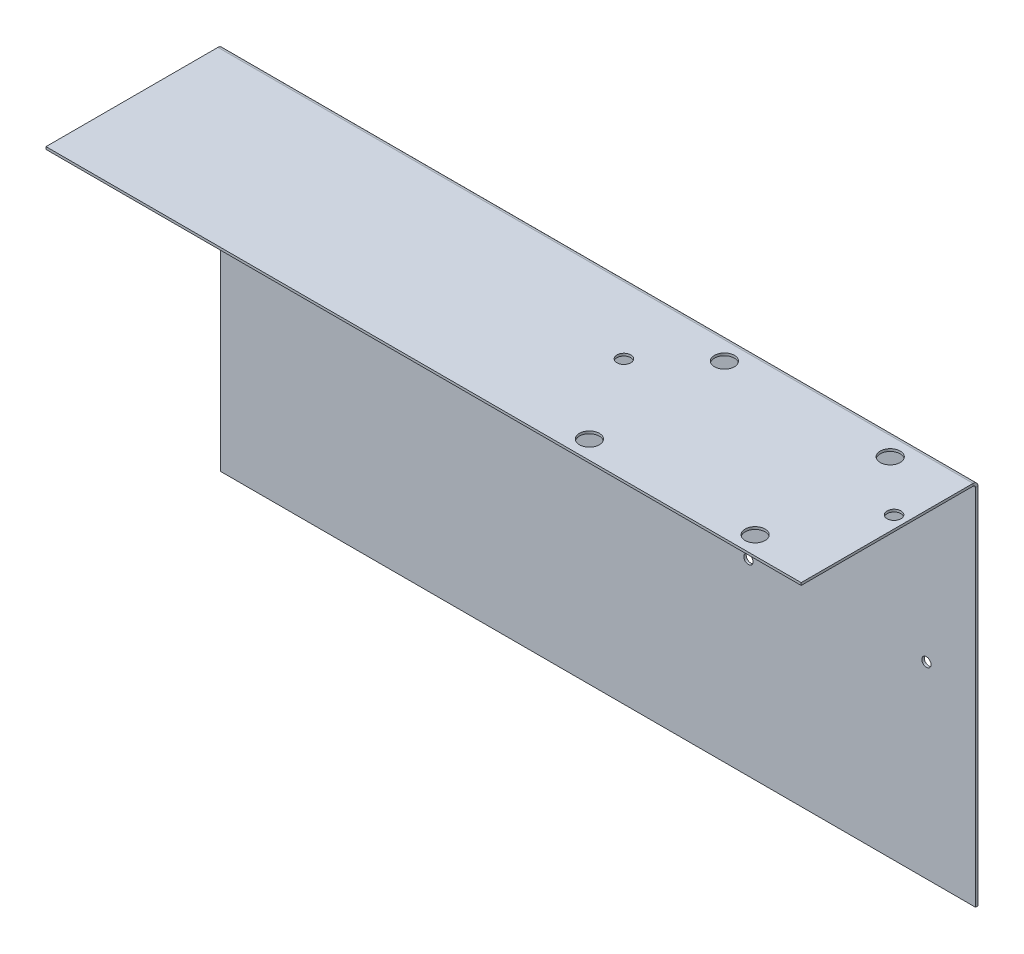
ISO-10303-21;
HEADER;
FILE_DESCRIPTION(('STEP AP214'),'2;1');
FILE_NAME('part.step','',(''),(''),'','','');
FILE_SCHEMA(('AUTOMOTIVE_DESIGN { 1 0 10303 214 1 1 1 1 }'));
ENDSEC;
DATA;
#1=APPLICATION_CONTEXT('core data for automotive mechanical design processes');
#2=APPLICATION_PROTOCOL_DEFINITION('international standard','automotive_design',2000,#1);
#3=PRODUCT_CONTEXT('',#1,'mechanical');
#4=PRODUCT('Part','Part','',(#3));
#5=PRODUCT_RELATED_PRODUCT_CATEGORY('part','',(#4));
#6=PRODUCT_DEFINITION_FORMATION('','',#4);
#7=PRODUCT_DEFINITION_CONTEXT('part definition',#1,'design');
#8=PRODUCT_DEFINITION('design','',#6,#7);
#9=PRODUCT_DEFINITION_SHAPE('','',#8);
#10=(LENGTH_UNIT() NAMED_UNIT(*) SI_UNIT(.MILLI.,.METRE.));
#11=(NAMED_UNIT(*) PLANE_ANGLE_UNIT() SI_UNIT($,.RADIAN.));
#12=(NAMED_UNIT(*) SI_UNIT($,.STERADIAN.) SOLID_ANGLE_UNIT());
#13=UNCERTAINTY_MEASURE_WITH_UNIT(LENGTH_MEASURE(1.E-05),#10,'distance_accuracy_value','');
#14=(GEOMETRIC_REPRESENTATION_CONTEXT(3) GLOBAL_UNCERTAINTY_ASSIGNED_CONTEXT((#13)) GLOBAL_UNIT_ASSIGNED_CONTEXT((#10,
#11,#12)) REPRESENTATION_CONTEXT('',''));
#15=CARTESIAN_POINT('',(0.,0.,0.));
#16=DIRECTION('',(0.,0.,1.));
#17=DIRECTION('',(1.,0.,0.));
#18=AXIS2_PLACEMENT_3D('',#15,#16,#17);
#19=CARTESIAN_POINT('',(-150.,0.8,-56.));
#20=DIRECTION('',(1.,0.,0.));
#21=DIRECTION('',(0.,0.,1.));
#22=AXIS2_PLACEMENT_3D('',#19,#20,#21);
#23=PLANE('',#22);
#24=DIRECTION('',(0.,1.,0.));
#25=VECTOR('',#24,1.);
#26=CARTESIAN_POINT('',(-150.,0.8,-56.));
#27=LINE('',#26,#25);
#28=CARTESIAN_POINT('',(-150.,0.,-56.));
#29=VERTEX_POINT('',#28);
#30=CARTESIAN_POINT('',(-150.,0.8,-56.));
#31=VERTEX_POINT('',#30);
#32=EDGE_CURVE('E76',#29,#31,#27,.T.);
#33=ORIENTED_EDGE('',*,*,#32,.F.);
#34=DIRECTION('',(0.,0.,-1.));
#35=VECTOR('',#34,1.);
#36=CARTESIAN_POINT('',(-150.,0.,0.));
#37=LINE('',#36,#35);
#38=CARTESIAN_POINT('',(-150.,0.,0.));
#39=VERTEX_POINT('',#38);
#40=EDGE_CURVE('E236',#29,#39,#37,.F.);
#41=ORIENTED_EDGE('',*,*,#40,.T.);
#42=DIRECTION('',(0.,1.,0.));
#43=VECTOR('',#42,1.);
#44=CARTESIAN_POINT('',(-150.,0.8,0.));
#45=LINE('',#44,#43);
#46=CARTESIAN_POINT('',(-150.,0.8,0.));
#47=VERTEX_POINT('',#46);
#48=EDGE_CURVE('E84',#39,#47,#45,.T.);
#49=ORIENTED_EDGE('',*,*,#48,.T.);
#50=DIRECTION('',(0.,0.,1.));
#51=VECTOR('',#50,1.);
#52=CARTESIAN_POINT('',(-150.,0.8,-56.));
#53=LINE('',#52,#51);
#54=EDGE_CURVE('E213',#31,#47,#53,.T.);
#55=ORIENTED_EDGE('',*,*,#54,.F.);
#56=EDGE_LOOP('',(#33,#41,#49,#55));
#57=FACE_BOUND('',#56,.T.);
#58=ADVANCED_FACE('F66',(#57),#23,.F.);
#59=CARTESIAN_POINT('',(-150.,0.8,0.));
#60=DIRECTION('',(0.,0.,-1.));
#61=DIRECTION('',(1.,0.,0.));
#62=AXIS2_PLACEMENT_3D('',#59,#60,#61);
#63=PLANE('',#62);
#64=ORIENTED_EDGE('',*,*,#48,.F.);
#65=DIRECTION('',(1.,0.,0.));
#66=VECTOR('',#65,1.);
#67=CARTESIAN_POINT('',(0.,0.,0.));
#68=LINE('',#67,#66);
#69=CARTESIAN_POINT('',(96.,0.,0.));
#70=VERTEX_POINT('',#69);
#71=EDGE_CURVE('E201',#39,#70,#68,.T.);
#72=ORIENTED_EDGE('',*,*,#71,.T.);
#73=DIRECTION('',(0.,1.,0.));
#74=VECTOR('',#73,1.);
#75=CARTESIAN_POINT('',(96.,0.8,0.));
#76=LINE('',#75,#74);
#77=CARTESIAN_POINT('',(96.,0.8,0.));
#78=VERTEX_POINT('',#77);
#79=EDGE_CURVE('E70',#70,#78,#76,.T.);
#80=ORIENTED_EDGE('',*,*,#79,.T.);
#81=DIRECTION('',(1.,0.,0.));
#82=VECTOR('',#81,1.);
#83=CARTESIAN_POINT('',(-150.,0.8,0.));
#84=LINE('',#83,#82);
#85=EDGE_CURVE('E205',#47,#78,#84,.T.);
#86=ORIENTED_EDGE('',*,*,#85,.F.);
#87=EDGE_LOOP('',(#64,#72,#80,#86));
#88=FACE_BOUND('',#87,.T.);
#89=ADVANCED_FACE('F268',(#88),#63,.F.);
#90=CARTESIAN_POINT('',(96.,0.8,-56.));
#91=DIRECTION('',(-1.,0.,0.));
#92=DIRECTION('',(0.,0.,-1.));
#93=AXIS2_PLACEMENT_3D('',#90,#91,#92);
#94=PLANE('',#93);
#95=DIRECTION('',(0.,0.,-1.));
#96=VECTOR('',#95,1.);
#97=CARTESIAN_POINT('',(96.,0.,0.));
#98=LINE('',#97,#96);
#99=CARTESIAN_POINT('',(96.,0.,-56.));
#100=VERTEX_POINT('',#99);
#101=EDGE_CURVE('E235',#70,#100,#98,.T.);
#102=ORIENTED_EDGE('',*,*,#101,.T.);
#103=DIRECTION('',(0.,1.,0.));
#104=VECTOR('',#103,1.);
#105=CARTESIAN_POINT('',(96.,0.8,-56.));
#106=LINE('',#105,#104);
#107=CARTESIAN_POINT('',(96.,0.799999999999951,-56.0000000000001));
#108=VERTEX_POINT('',#107);
#109=EDGE_CURVE('E13',#100,#108,#106,.T.);
#110=ORIENTED_EDGE('',*,*,#109,.T.);
#111=DIRECTION('',(0.,0.,-1.));
#112=VECTOR('',#111,1.);
#113=CARTESIAN_POINT('',(96.,0.8,-56.));
#114=LINE('',#113,#112);
#115=EDGE_CURVE('E208',#78,#108,#114,.T.);
#116=ORIENTED_EDGE('',*,*,#115,.F.);
#117=ORIENTED_EDGE('',*,*,#79,.F.);
#118=EDGE_LOOP('',(#102,#110,#116,#117));
#119=FACE_BOUND('',#118,.T.);
#120=ADVANCED_FACE('F273',(#119),#94,.F.);
#121=CARTESIAN_POINT('',(21.,0.8,-50.));
#122=DIRECTION('',(0.,-1.,0.));
#123=DIRECTION('',(0.,0.,-1.));
#124=AXIS2_PLACEMENT_3D('',#121,#122,#123);
#125=CYLINDRICAL_SURFACE('',#124,3.25);
#126=CARTESIAN_POINT('',(21.,0.8,-50.));
#127=DIRECTION('',(0.,1.,0.));
#128=DIRECTION('',(0.,0.,1.));
#129=AXIS2_PLACEMENT_3D('',#126,#127,#128);
#130=CIRCLE('',#129,3.25);
#131=CARTESIAN_POINT('',(21.,0.8,-46.75));
#132=VERTEX_POINT('',#131);
#133=EDGE_CURVE('E216',#132,#132,#130,.T.);
#134=ORIENTED_EDGE('',*,*,#133,.T.);
#135=EDGE_LOOP('',(#134));
#136=FACE_BOUND('',#135,.T.);
#137=CARTESIAN_POINT('',(21.,0.,-50.));
#138=DIRECTION('',(0.,1.,0.));
#139=DIRECTION('',(0.,0.,1.));
#140=AXIS2_PLACEMENT_3D('',#137,#138,#139);
#141=CIRCLE('',#140,3.25);
#142=CARTESIAN_POINT('',(21.,0.,-46.75));
#143=VERTEX_POINT('',#142);
#144=EDGE_CURVE('E238',#143,#143,#141,.T.);
#145=ORIENTED_EDGE('',*,*,#144,.F.);
#146=EDGE_LOOP('',(#145));
#147=FACE_BOUND('',#146,.T.);
#148=ADVANCED_FACE('F279',(#136,#147),#125,.F.);
#149=CARTESIAN_POINT('',(75.,0.8,-50.));
#150=DIRECTION('',(0.,-1.,0.));
#151=DIRECTION('',(0.,0.,-1.));
#152=AXIS2_PLACEMENT_3D('',#149,#150,#151);
#153=CYLINDRICAL_SURFACE('',#152,3.25000000000001);
#154=CARTESIAN_POINT('',(75.,0.8,-50.));
#155=DIRECTION('',(0.,1.,0.));
#156=DIRECTION('',(0.,0.,-1.));
#157=AXIS2_PLACEMENT_3D('',#154,#155,#156);
#158=CIRCLE('',#157,3.25000000000001);
#159=CARTESIAN_POINT('',(75.,0.8,-53.25));
#160=VERTEX_POINT('',#159);
#161=EDGE_CURVE('E219',#160,#160,#158,.T.);
#162=ORIENTED_EDGE('',*,*,#161,.T.);
#163=EDGE_LOOP('',(#162));
#164=FACE_BOUND('',#163,.T.);
#165=CARTESIAN_POINT('',(75.,0.,-50.));
#166=DIRECTION('',(0.,1.,0.));
#167=DIRECTION('',(0.,0.,1.));
#168=AXIS2_PLACEMENT_3D('',#165,#166,#167);
#169=CIRCLE('',#168,3.25000000000001);
#170=CARTESIAN_POINT('',(75.,0.,-46.75));
#171=VERTEX_POINT('',#170);
#172=EDGE_CURVE('E244',#171,#171,#169,.T.);
#173=ORIENTED_EDGE('',*,*,#172,.F.);
#174=EDGE_LOOP('',(#173));
#175=FACE_BOUND('',#174,.T.);
#176=ADVANCED_FACE('F282',(#164,#175),#153,.F.);
#177=CARTESIAN_POINT('',(75.,0.8,-6.));
#178=DIRECTION('',(0.,-1.,0.));
#179=DIRECTION('',(0.,0.,-1.));
#180=AXIS2_PLACEMENT_3D('',#177,#178,#179);
#181=CYLINDRICAL_SURFACE('',#180,3.25000000000001);
#182=CARTESIAN_POINT('',(75.,0.8,-6.));
#183=DIRECTION('',(0.,1.,0.));
#184=DIRECTION('',(0.,0.,1.));
#185=AXIS2_PLACEMENT_3D('',#182,#183,#184);
#186=CIRCLE('',#185,3.25000000000001);
#187=CARTESIAN_POINT('',(75.,0.8,-2.74999999999999));
#188=VERTEX_POINT('',#187);
#189=EDGE_CURVE('E222',#188,#188,#186,.T.);
#190=ORIENTED_EDGE('',*,*,#189,.T.);
#191=EDGE_LOOP('',(#190));
#192=FACE_BOUND('',#191,.T.);
#193=CARTESIAN_POINT('',(75.,0.,-6.));
#194=DIRECTION('',(0.,1.,0.));
#195=DIRECTION('',(0.,0.,1.));
#196=AXIS2_PLACEMENT_3D('',#193,#194,#195);
#197=CIRCLE('',#196,3.25000000000001);
#198=CARTESIAN_POINT('',(75.,0.,-2.74999999999999));
#199=VERTEX_POINT('',#198);
#200=EDGE_CURVE('E247',#199,#199,#197,.T.);
#201=ORIENTED_EDGE('',*,*,#200,.F.);
#202=EDGE_LOOP('',(#201));
#203=FACE_BOUND('',#202,.T.);
#204=ADVANCED_FACE('F286',(#192,#203),#181,.F.);
#205=CARTESIAN_POINT('',(21.,0.8,-6.));
#206=DIRECTION('',(0.,-1.,0.));
#207=DIRECTION('',(0.,0.,-1.));
#208=AXIS2_PLACEMENT_3D('',#205,#206,#207);
#209=CYLINDRICAL_SURFACE('',#208,3.25);
#210=CARTESIAN_POINT('',(21.,0.8,-6.));
#211=DIRECTION('',(0.,1.,0.));
#212=DIRECTION('',(0.,0.,-1.));
#213=AXIS2_PLACEMENT_3D('',#210,#211,#212);
#214=CIRCLE('',#213,3.25);
#215=CARTESIAN_POINT('',(21.,0.8,-9.25));
#216=VERTEX_POINT('',#215);
#217=EDGE_CURVE('E225',#216,#216,#214,.T.);
#218=ORIENTED_EDGE('',*,*,#217,.T.);
#219=EDGE_LOOP('',(#218));
#220=FACE_BOUND('',#219,.T.);
#221=CARTESIAN_POINT('',(21.,0.,-6.));
#222=DIRECTION('',(0.,1.,0.));
#223=DIRECTION('',(0.,0.,1.));
#224=AXIS2_PLACEMENT_3D('',#221,#222,#223);
#225=CIRCLE('',#224,3.25);
#226=CARTESIAN_POINT('',(21.,0.,-2.75));
#227=VERTEX_POINT('',#226);
#228=EDGE_CURVE('E250',#227,#227,#225,.T.);
#229=ORIENTED_EDGE('',*,*,#228,.F.);
#230=EDGE_LOOP('',(#229));
#231=FACE_BOUND('',#230,.T.);
#232=ADVANCED_FACE('F290',(#220,#231),#209,.F.);
#233=CARTESIAN_POINT('',(92.,0.8,-34.25));
#234=DIRECTION('',(0.,-1.,0.));
#235=DIRECTION('',(0.,0.,-1.));
#236=AXIS2_PLACEMENT_3D('',#233,#234,#235);
#237=CYLINDRICAL_SURFACE('',#236,2.25);
#238=CARTESIAN_POINT('',(92.,0.8,-34.25));
#239=DIRECTION('',(0.,1.,0.));
#240=DIRECTION('',(0.,0.,1.));
#241=AXIS2_PLACEMENT_3D('',#238,#239,#240);
#242=CIRCLE('',#241,2.25);
#243=CARTESIAN_POINT('',(92.,0.8,-32.));
#244=VERTEX_POINT('',#243);
#245=EDGE_CURVE('E228',#244,#244,#242,.T.);
#246=ORIENTED_EDGE('',*,*,#245,.T.);
#247=EDGE_LOOP('',(#246));
#248=FACE_BOUND('',#247,.T.);
#249=CARTESIAN_POINT('',(92.,0.,-34.25));
#250=DIRECTION('',(0.,1.,0.));
#251=DIRECTION('',(0.,0.,1.));
#252=AXIS2_PLACEMENT_3D('',#249,#250,#251);
#253=CIRCLE('',#252,2.25);
#254=CARTESIAN_POINT('',(92.,0.,-32.));
#255=VERTEX_POINT('',#254);
#256=EDGE_CURVE('E253',#255,#255,#253,.T.);
#257=ORIENTED_EDGE('',*,*,#256,.F.);
#258=EDGE_LOOP('',(#257));
#259=FACE_BOUND('',#258,.T.);
#260=ADVANCED_FACE('F293',(#248,#259),#237,.F.);
#261=CARTESIAN_POINT('',(4.,0.8,-34.25));
#262=DIRECTION('',(0.,-1.,0.));
#263=DIRECTION('',(0.,0.,-1.));
#264=AXIS2_PLACEMENT_3D('',#261,#262,#263);
#265=CYLINDRICAL_SURFACE('',#264,2.25);
#266=CARTESIAN_POINT('',(4.,0.8,-34.25));
#267=DIRECTION('',(0.,1.,0.));
#268=DIRECTION('',(0.,0.,-1.));
#269=AXIS2_PLACEMENT_3D('',#266,#267,#268);
#270=CIRCLE('',#269,2.25);
#271=CARTESIAN_POINT('',(4.,0.8,-36.5));
#272=VERTEX_POINT('',#271);
#273=EDGE_CURVE('E231',#272,#272,#270,.T.);
#274=ORIENTED_EDGE('',*,*,#273,.T.);
#275=EDGE_LOOP('',(#274));
#276=FACE_BOUND('',#275,.T.);
#277=CARTESIAN_POINT('',(4.,0.,-34.25));
#278=DIRECTION('',(0.,1.,0.));
#279=DIRECTION('',(0.,0.,1.));
#280=AXIS2_PLACEMENT_3D('',#277,#278,#279);
#281=CIRCLE('',#280,2.25);
#282=CARTESIAN_POINT('',(4.,0.,-32.));
#283=VERTEX_POINT('',#282);
#284=EDGE_CURVE('E209',#283,#283,#281,.T.);
#285=ORIENTED_EDGE('',*,*,#284,.F.);
#286=EDGE_LOOP('',(#285));
#287=FACE_BOUND('',#286,.T.);
#288=ADVANCED_FACE('F68',(#276,#287),#265,.F.);
#289=CARTESIAN_POINT('',(0.,0.8,0.));
#290=DIRECTION('',(0.,-1.,0.));
#291=DIRECTION('',(0.,0.,-1.));
#292=AXIS2_PLACEMENT_3D('',#289,#290,#291);
#293=PLANE('',#292);
#294=ORIENTED_EDGE('',*,*,#85,.T.);
#295=ORIENTED_EDGE('',*,*,#115,.T.);
#296=DIRECTION('',(-1.,0.,0.));
#297=VECTOR('',#296,1.);
#298=CARTESIAN_POINT('',(0.,0.8,-56.));
#299=LINE('',#298,#297);
#300=EDGE_CURVE('E107',#108,#31,#299,.T.);
#301=ORIENTED_EDGE('',*,*,#300,.T.);
#302=ORIENTED_EDGE('',*,*,#54,.T.);
#303=EDGE_LOOP('',(#294,#295,#301,#302));
#304=FACE_BOUND('',#303,.T.);
#305=ORIENTED_EDGE('',*,*,#133,.F.);
#306=EDGE_LOOP('',(#305));
#307=FACE_BOUND('',#306,.T.);
#308=ORIENTED_EDGE('',*,*,#161,.F.);
#309=EDGE_LOOP('',(#308));
#310=FACE_BOUND('',#309,.T.);
#311=ORIENTED_EDGE('',*,*,#189,.F.);
#312=EDGE_LOOP('',(#311));
#313=FACE_BOUND('',#312,.T.);
#314=ORIENTED_EDGE('',*,*,#217,.F.);
#315=EDGE_LOOP('',(#314));
#316=FACE_BOUND('',#315,.T.);
#317=ORIENTED_EDGE('',*,*,#245,.F.);
#318=EDGE_LOOP('',(#317));
#319=FACE_BOUND('',#318,.T.);
#320=ORIENTED_EDGE('',*,*,#273,.F.);
#321=EDGE_LOOP('',(#320));
#322=FACE_BOUND('',#321,.T.);
#323=ADVANCED_FACE('F265',(#304,#307,#310,#313,#316,#319,#322),#293,.F.);
#324=CARTESIAN_POINT('',(0.,0.,0.));
#325=DIRECTION('',(0.,-1.,0.));
#326=DIRECTION('',(0.,0.,-1.));
#327=AXIS2_PLACEMENT_3D('',#324,#325,#326);
#328=PLANE('',#327);
#329=ORIENTED_EDGE('',*,*,#71,.F.);
#330=ORIENTED_EDGE('',*,*,#40,.F.);
#331=DIRECTION('',(1.,0.,0.));
#332=VECTOR('',#331,1.);
#333=CARTESIAN_POINT('',(0.,0.,-56.));
#334=LINE('',#333,#332);
#335=EDGE_CURVE('E239',#100,#29,#334,.F.);
#336=ORIENTED_EDGE('',*,*,#335,.F.);
#337=ORIENTED_EDGE('',*,*,#101,.F.);
#338=EDGE_LOOP('',(#329,#330,#336,#337));
#339=FACE_BOUND('',#338,.T.);
#340=ORIENTED_EDGE('',*,*,#144,.T.);
#341=EDGE_LOOP('',(#340));
#342=FACE_BOUND('',#341,.T.);
#343=ORIENTED_EDGE('',*,*,#172,.T.);
#344=EDGE_LOOP('',(#343));
#345=FACE_BOUND('',#344,.T.);
#346=ORIENTED_EDGE('',*,*,#200,.T.);
#347=EDGE_LOOP('',(#346));
#348=FACE_BOUND('',#347,.T.);
#349=ORIENTED_EDGE('',*,*,#228,.T.);
#350=EDGE_LOOP('',(#349));
#351=FACE_BOUND('',#350,.T.);
#352=ORIENTED_EDGE('',*,*,#256,.T.);
#353=EDGE_LOOP('',(#352));
#354=FACE_BOUND('',#353,.T.);
#355=ORIENTED_EDGE('',*,*,#284,.T.);
#356=EDGE_LOOP('',(#355));
#357=FACE_BOUND('',#356,.T.);
#358=ADVANCED_FACE('F305',(#339,#342,#345,#348,#351,#354,#357),#328,.T.);
#359=CARTESIAN_POINT('',(-150.,-0.799999999999999,-56.));
#360=DIRECTION('',(-1.,0.,0.));
#361=DIRECTION('',(0.,-1.,0.));
#362=AXIS2_PLACEMENT_3D('',#359,#360,#361);
#363=PLANE('',#362);
#364=DIRECTION('',(0.,0.,1.));
#365=VECTOR('',#364,1.);
#366=CARTESIAN_POINT('',(-150.,-0.799999999999995,-57.5999999999996));
#367=LINE('',#366,#365);
#368=CARTESIAN_POINT('',(-150.,-0.799999999999996,-56.8));
#369=VERTEX_POINT('',#368);
#370=CARTESIAN_POINT('',(-150.,-0.799999999999994,-57.6));
#371=VERTEX_POINT('',#370);
#372=EDGE_CURVE('E141',#369,#371,#367,.F.);
#373=ORIENTED_EDGE('',*,*,#372,.F.);
#374=CARTESIAN_POINT('',(-150.,-0.799999999999999,-56.));
#375=DIRECTION('',(1.,0.,0.));
#376=DIRECTION('',(0.,1.,0.));
#377=AXIS2_PLACEMENT_3D('',#374,#375,#376);
#378=CIRCLE('',#377,0.799999999999967);
#379=EDGE_CURVE('E135',#29,#369,#378,.F.);
#380=ORIENTED_EDGE('',*,*,#379,.F.);
#381=ORIENTED_EDGE('',*,*,#32,.T.);
#382=CARTESIAN_POINT('',(-150.,-0.799999999999999,-56.));
#383=DIRECTION('',(1.,0.,0.));
#384=DIRECTION('',(0.,1.,0.));
#385=AXIS2_PLACEMENT_3D('',#382,#383,#384);
#386=CIRCLE('',#385,1.59999999999997);
#387=EDGE_CURVE('E198',#31,#371,#386,.F.);
#388=ORIENTED_EDGE('',*,*,#387,.T.);
#389=EDGE_LOOP('',(#373,#380,#381,#388));
#390=FACE_BOUND('',#389,.T.);
#391=ADVANCED_FACE('F262',(#390),#363,.T.);
#392=CARTESIAN_POINT('',(96.,-0.800000000000016,-56.));
#393=DIRECTION('',(-1.,0.,0.));
#394=DIRECTION('',(0.,-1.,0.));
#395=AXIS2_PLACEMENT_3D('',#392,#393,#394);
#396=PLANE('',#395);
#397=CARTESIAN_POINT('',(96.,-0.800000000000016,-56.));
#398=DIRECTION('',(1.,0.,0.));
#399=DIRECTION('',(0.,1.,0.));
#400=AXIS2_PLACEMENT_3D('',#397,#398,#399);
#401=CIRCLE('',#400,0.799999999999967);
#402=CARTESIAN_POINT('',(96.,-0.800000000000013,-56.8));
#403=VERTEX_POINT('',#402);
#404=EDGE_CURVE('E132',#403,#100,#401,.T.);
#405=ORIENTED_EDGE('',*,*,#404,.F.);
#406=DIRECTION('',(0.,0.,1.));
#407=VECTOR('',#406,1.);
#408=CARTESIAN_POINT('',(96.,-0.800000000000009,-56.8));
#409=LINE('',#408,#407);
#410=CARTESIAN_POINT('',(96.,-0.800000000000003,-57.6));
#411=VERTEX_POINT('',#410);
#412=EDGE_CURVE('E140',#403,#411,#409,.F.);
#413=ORIENTED_EDGE('',*,*,#412,.T.);
#414=CARTESIAN_POINT('',(96.,-0.800000000000016,-56.));
#415=DIRECTION('',(1.,0.,0.));
#416=DIRECTION('',(0.,1.,0.));
#417=AXIS2_PLACEMENT_3D('',#414,#415,#416);
#418=CIRCLE('',#417,1.59999999999997);
#419=EDGE_CURVE('E202',#411,#108,#418,.T.);
#420=ORIENTED_EDGE('',*,*,#419,.T.);
#421=ORIENTED_EDGE('',*,*,#109,.F.);
#422=EDGE_LOOP('',(#405,#413,#420,#421));
#423=FACE_BOUND('',#422,.T.);
#424=ADVANCED_FACE('F146',(#423),#396,.F.);
#425=CARTESIAN_POINT('',(96.,-0.800000000000016,-56.));
#426=DIRECTION('',(1.,0.,0.));
#427=DIRECTION('',(0.,0.,-1.));
#428=AXIS2_PLACEMENT_3D('',#425,#426,#427);
#429=CYLINDRICAL_SURFACE('',#428,1.59999999999997);
#430=ORIENTED_EDGE('',*,*,#300,.F.);
#431=ORIENTED_EDGE('',*,*,#419,.F.);
#432=DIRECTION('',(1.,0.,0.));
#433=VECTOR('',#432,1.);
#434=CARTESIAN_POINT('',(0.,-0.799999999999998,-57.6));
#435=LINE('',#434,#433);
#436=EDGE_CURVE('E160',#371,#411,#435,.T.);
#437=ORIENTED_EDGE('',*,*,#436,.F.);
#438=ORIENTED_EDGE('',*,*,#387,.F.);
#439=EDGE_LOOP('',(#430,#431,#437,#438));
#440=FACE_BOUND('',#439,.T.);
#441=ADVANCED_FACE('F320',(#440),#429,.T.);
#442=CARTESIAN_POINT('',(96.,-0.800000000000016,-56.));
#443=DIRECTION('',(1.,0.,0.));
#444=DIRECTION('',(0.,0.,-1.));
#445=AXIS2_PLACEMENT_3D('',#442,#443,#444);
#446=CYLINDRICAL_SURFACE('',#445,0.799999999999967);
#447=ORIENTED_EDGE('',*,*,#335,.T.);
#448=ORIENTED_EDGE('',*,*,#379,.T.);
#449=DIRECTION('',(-1.,0.,0.));
#450=VECTOR('',#449,1.);
#451=CARTESIAN_POINT('',(-150.,-0.799999999999995,-56.8));
#452=LINE('',#451,#450);
#453=EDGE_CURVE('E129',#369,#403,#452,.F.);
#454=ORIENTED_EDGE('',*,*,#453,.T.);
#455=ORIENTED_EDGE('',*,*,#404,.T.);
#456=EDGE_LOOP('',(#447,#448,#454,#455));
#457=FACE_BOUND('',#456,.T.);
#458=ADVANCED_FACE('F131',(#457),#446,.F.);
#459=CARTESIAN_POINT('',(0.,1.98386167597319E-13,-57.6));
#460=DIRECTION('',(0.,0.,-1.));
#461=DIRECTION('',(0.,1.,0.));
#462=AXIS2_PLACEMENT_3D('',#459,#460,#461);
#463=PLANE('',#462);
#464=CARTESIAN_POINT('',(22.,-58.,-57.6000000000002));
#465=DIRECTION('',(0.,0.,-1.));
#466=DIRECTION('',(0.,1.,0.));
#467=AXIS2_PLACEMENT_3D('',#464,#465,#466);
#468=CIRCLE('',#467,1.5);
#469=CARTESIAN_POINT('',(22.,-56.5,-57.6000000000002));
#470=VERTEX_POINT('',#469);
#471=EDGE_CURVE('E183',#470,#470,#468,.T.);
#472=ORIENTED_EDGE('',*,*,#471,.F.);
#473=EDGE_LOOP('',(#472));
#474=FACE_BOUND('',#473,.T.);
#475=CARTESIAN_POINT('',(22.,-9.00000000000001,-57.6));
#476=DIRECTION('',(0.,0.,-1.));
#477=DIRECTION('',(0.,1.,0.));
#478=AXIS2_PLACEMENT_3D('',#475,#476,#477);
#479=CIRCLE('',#478,1.5);
#480=CARTESIAN_POINT('',(22.,-7.50000000000001,-57.6));
#481=VERTEX_POINT('',#480);
#482=EDGE_CURVE('E166',#481,#481,#479,.T.);
#483=ORIENTED_EDGE('',*,*,#482,.F.);
#484=EDGE_LOOP('',(#483));
#485=FACE_BOUND('',#484,.T.);
#486=CARTESIAN_POINT('',(80.,-58.,-57.6000000000002));
#487=DIRECTION('',(0.,0.,-1.));
#488=DIRECTION('',(0.,1.,0.));
#489=AXIS2_PLACEMENT_3D('',#486,#487,#488);
#490=CIRCLE('',#489,1.5);
#491=CARTESIAN_POINT('',(80.,-56.5,-57.6000000000002));
#492=VERTEX_POINT('',#491);
#493=EDGE_CURVE('E177',#492,#492,#490,.T.);
#494=ORIENTED_EDGE('',*,*,#493,.F.);
#495=EDGE_LOOP('',(#494));
#496=FACE_BOUND('',#495,.T.);
#497=CARTESIAN_POINT('',(80.,-9.,-57.6000000000001));
#498=DIRECTION('',(0.,0.,-1.));
#499=DIRECTION('',(0.,1.,0.));
#500=AXIS2_PLACEMENT_3D('',#497,#498,#499);
#501=CIRCLE('',#500,1.5);
#502=CARTESIAN_POINT('',(80.,-7.5,-57.6));
#503=VERTEX_POINT('',#502);
#504=EDGE_CURVE('E189',#503,#503,#501,.T.);
#505=ORIENTED_EDGE('',*,*,#504,.F.);
#506=EDGE_LOOP('',(#505));
#507=FACE_BOUND('',#506,.T.);
#508=DIRECTION('',(0.,-1.,0.));
#509=VECTOR('',#508,1.);
#510=CARTESIAN_POINT('',(-150.,2.33313485905576E-13,-57.6));
#511=LINE('',#510,#509);
#512=CARTESIAN_POINT('',(-150.,-119.2,-57.6000000000004));
#513=VERTEX_POINT('',#512);
#514=EDGE_CURVE('E377',#513,#371,#511,.F.);
#515=ORIENTED_EDGE('',*,*,#514,.T.);
#516=ORIENTED_EDGE('',*,*,#436,.T.);
#517=DIRECTION('',(0.,1.,0.));
#518=VECTOR('',#517,1.);
#519=CARTESIAN_POINT('',(96.,2.09562909455961E-13,-57.6));
#520=LINE('',#519,#518);
#521=CARTESIAN_POINT('',(96.,-119.2,-57.6000000000004));
#522=VERTEX_POINT('',#521);
#523=EDGE_CURVE('E159',#411,#522,#520,.F.);
#524=ORIENTED_EDGE('',*,*,#523,.T.);
#525=DIRECTION('',(1.,0.,0.));
#526=VECTOR('',#525,1.);
#527=CARTESIAN_POINT('',(0.,-119.2,-57.6000000000004));
#528=LINE('',#527,#526);
#529=EDGE_CURVE('E380',#522,#513,#528,.F.);
#530=ORIENTED_EDGE('',*,*,#529,.T.);
#531=EDGE_LOOP('',(#515,#516,#524,#530));
#532=FACE_BOUND('',#531,.T.);
#533=ADVANCED_FACE('F324',(#474,#485,#496,#507,#532),#463,.T.);
#534=CARTESIAN_POINT('',(0.,1.95592982526244E-13,-56.8));
#535=DIRECTION('',(0.,0.,-1.));
#536=DIRECTION('',(0.,1.,0.));
#537=AXIS2_PLACEMENT_3D('',#534,#535,#536);
#538=PLANE('',#537);
#539=CARTESIAN_POINT('',(80.,-9.,-56.8000000000001));
#540=DIRECTION('',(0.,0.,-1.));
#541=DIRECTION('',(0.,1.,0.));
#542=AXIS2_PLACEMENT_3D('',#539,#540,#541);
#543=CIRCLE('',#542,1.5);
#544=CARTESIAN_POINT('',(80.,-7.5,-56.8));
#545=VERTEX_POINT('',#544);
#546=EDGE_CURVE('E192',#545,#545,#543,.T.);
#547=ORIENTED_EDGE('',*,*,#546,.T.);
#548=EDGE_LOOP('',(#547));
#549=FACE_BOUND('',#548,.T.);
#550=CARTESIAN_POINT('',(22.,-58.,-56.8000000000002));
#551=DIRECTION('',(0.,0.,-1.));
#552=DIRECTION('',(0.,1.,0.));
#553=AXIS2_PLACEMENT_3D('',#550,#551,#552);
#554=CIRCLE('',#553,1.5);
#555=CARTESIAN_POINT('',(22.,-56.5,-56.8000000000002));
#556=VERTEX_POINT('',#555);
#557=EDGE_CURVE('E186',#556,#556,#554,.T.);
#558=ORIENTED_EDGE('',*,*,#557,.T.);
#559=EDGE_LOOP('',(#558));
#560=FACE_BOUND('',#559,.T.);
#561=CARTESIAN_POINT('',(80.,-58.,-56.8000000000002));
#562=DIRECTION('',(0.,0.,-1.));
#563=DIRECTION('',(0.,1.,0.));
#564=AXIS2_PLACEMENT_3D('',#561,#562,#563);
#565=CIRCLE('',#564,1.5);
#566=CARTESIAN_POINT('',(80.,-56.5,-56.8000000000002));
#567=VERTEX_POINT('',#566);
#568=EDGE_CURVE('E180',#567,#567,#565,.T.);
#569=ORIENTED_EDGE('',*,*,#568,.T.);
#570=EDGE_LOOP('',(#569));
#571=FACE_BOUND('',#570,.T.);
#572=CARTESIAN_POINT('',(22.,-9.00000000000001,-56.8));
#573=DIRECTION('',(0.,0.,-1.));
#574=DIRECTION('',(0.,1.,0.));
#575=AXIS2_PLACEMENT_3D('',#572,#573,#574);
#576=CIRCLE('',#575,1.5);
#577=CARTESIAN_POINT('',(22.,-7.50000000000001,-56.8));
#578=VERTEX_POINT('',#577);
#579=EDGE_CURVE('E171',#578,#578,#576,.T.);
#580=ORIENTED_EDGE('',*,*,#579,.T.);
#581=EDGE_LOOP('',(#580));
#582=FACE_BOUND('',#581,.T.);
#583=ORIENTED_EDGE('',*,*,#453,.F.);
#584=DIRECTION('',(0.,1.,0.));
#585=VECTOR('',#584,1.);
#586=CARTESIAN_POINT('',(-150.,-119.2,-56.8000000000004));
#587=LINE('',#586,#585);
#588=CARTESIAN_POINT('',(-150.,-119.2,-56.8000000000004));
#589=VERTEX_POINT('',#588);
#590=EDGE_CURVE('E168',#589,#369,#587,.T.);
#591=ORIENTED_EDGE('',*,*,#590,.F.);
#592=DIRECTION('',(-1.,0.,0.));
#593=VECTOR('',#592,1.);
#594=CARTESIAN_POINT('',(96.,-119.2,-56.8000000000004));
#595=LINE('',#594,#593);
#596=CARTESIAN_POINT('',(96.,-119.2,-56.8000000000004));
#597=VERTEX_POINT('',#596);
#598=EDGE_CURVE('E165',#597,#589,#595,.T.);
#599=ORIENTED_EDGE('',*,*,#598,.F.);
#600=DIRECTION('',(0.,-1.,0.));
#601=VECTOR('',#600,1.);
#602=CARTESIAN_POINT('',(96.,0.,-56.8));
#603=LINE('',#602,#601);
#604=EDGE_CURVE('E156',#403,#597,#603,.T.);
#605=ORIENTED_EDGE('',*,*,#604,.F.);
#606=EDGE_LOOP('',(#583,#591,#599,#605));
#607=FACE_BOUND('',#606,.T.);
#608=ADVANCED_FACE('F163',(#549,#560,#571,#582,#607),#538,.F.);
#609=CARTESIAN_POINT('',(96.,0.,-57.6));
#610=DIRECTION('',(-1.,0.,0.));
#611=DIRECTION('',(0.,0.,1.));
#612=AXIS2_PLACEMENT_3D('',#609,#610,#611);
#613=PLANE('',#612);
#614=ORIENTED_EDGE('',*,*,#412,.F.);
#615=ORIENTED_EDGE('',*,*,#604,.T.);
#616=DIRECTION('',(0.,0.,1.));
#617=VECTOR('',#616,1.);
#618=CARTESIAN_POINT('',(96.,-119.2,-57.6000000000004));
#619=LINE('',#618,#617);
#620=EDGE_CURVE('E148',#522,#597,#619,.T.);
#621=ORIENTED_EDGE('',*,*,#620,.F.);
#622=ORIENTED_EDGE('',*,*,#523,.F.);
#623=EDGE_LOOP('',(#614,#615,#621,#622));
#624=FACE_BOUND('',#623,.T.);
#625=ADVANCED_FACE('F153',(#624),#613,.F.);
#626=CARTESIAN_POINT('',(-150.,-119.2,-57.6000000000004));
#627=DIRECTION('',(1.,0.,0.));
#628=DIRECTION('',(0.,1.,0.));
#629=AXIS2_PLACEMENT_3D('',#626,#627,#628);
#630=PLANE('',#629);
#631=ORIENTED_EDGE('',*,*,#372,.T.);
#632=ORIENTED_EDGE('',*,*,#514,.F.);
#633=DIRECTION('',(0.,0.,1.));
#634=VECTOR('',#633,1.);
#635=CARTESIAN_POINT('',(-150.,-119.2,-57.6000000000004));
#636=LINE('',#635,#634);
#637=EDGE_CURVE('E383',#513,#589,#636,.T.);
#638=ORIENTED_EDGE('',*,*,#637,.T.);
#639=ORIENTED_EDGE('',*,*,#590,.T.);
#640=EDGE_LOOP('',(#631,#632,#638,#639));
#641=FACE_BOUND('',#640,.T.);
#642=ADVANCED_FACE('F329',(#641),#630,.F.);
#643=CARTESIAN_POINT('',(96.,-119.2,-57.6000000000004));
#644=DIRECTION('',(0.,1.,0.));
#645=DIRECTION('',(0.,0.,1.));
#646=AXIS2_PLACEMENT_3D('',#643,#644,#645);
#647=PLANE('',#646);
#648=ORIENTED_EDGE('',*,*,#598,.T.);
#649=ORIENTED_EDGE('',*,*,#637,.F.);
#650=ORIENTED_EDGE('',*,*,#529,.F.);
#651=ORIENTED_EDGE('',*,*,#620,.T.);
#652=EDGE_LOOP('',(#648,#649,#650,#651));
#653=FACE_BOUND('',#652,.T.);
#654=ADVANCED_FACE('F330',(#653),#647,.F.);
#655=CARTESIAN_POINT('',(22.,-9.00000000000001,-57.6));
#656=DIRECTION('',(0.,0.,1.));
#657=DIRECTION('',(0.,-1.,0.));
#658=AXIS2_PLACEMENT_3D('',#655,#656,#657);
#659=CYLINDRICAL_SURFACE('',#658,1.5);
#660=ORIENTED_EDGE('',*,*,#482,.T.);
#661=EDGE_LOOP('',(#660));
#662=FACE_BOUND('',#661,.T.);
#663=ORIENTED_EDGE('',*,*,#579,.F.);
#664=EDGE_LOOP('',(#663));
#665=FACE_BOUND('',#664,.T.);
#666=ADVANCED_FACE('F333',(#662,#665),#659,.F.);
#667=CARTESIAN_POINT('',(80.,-58.,-57.6000000000002));
#668=DIRECTION('',(0.,0.,1.));
#669=DIRECTION('',(0.,-1.,0.));
#670=AXIS2_PLACEMENT_3D('',#667,#668,#669);
#671=CYLINDRICAL_SURFACE('',#670,1.5);
#672=ORIENTED_EDGE('',*,*,#493,.T.);
#673=EDGE_LOOP('',(#672));
#674=FACE_BOUND('',#673,.T.);
#675=ORIENTED_EDGE('',*,*,#568,.F.);
#676=EDGE_LOOP('',(#675));
#677=FACE_BOUND('',#676,.T.);
#678=ADVANCED_FACE('F346',(#674,#677),#671,.F.);
#679=CARTESIAN_POINT('',(22.,-58.,-57.6000000000002));
#680=DIRECTION('',(0.,0.,1.));
#681=DIRECTION('',(0.,-1.,0.));
#682=AXIS2_PLACEMENT_3D('',#679,#680,#681);
#683=CYLINDRICAL_SURFACE('',#682,1.5);
#684=ORIENTED_EDGE('',*,*,#471,.T.);
#685=EDGE_LOOP('',(#684));
#686=FACE_BOUND('',#685,.T.);
#687=ORIENTED_EDGE('',*,*,#557,.F.);
#688=EDGE_LOOP('',(#687));
#689=FACE_BOUND('',#688,.T.);
#690=ADVANCED_FACE('F350',(#686,#689),#683,.F.);
#691=CARTESIAN_POINT('',(80.,-9.,-57.6000000000001));
#692=DIRECTION('',(0.,0.,1.));
#693=DIRECTION('',(0.,-1.,0.));
#694=AXIS2_PLACEMENT_3D('',#691,#692,#693);
#695=CYLINDRICAL_SURFACE('',#694,1.5);
#696=ORIENTED_EDGE('',*,*,#504,.T.);
#697=EDGE_LOOP('',(#696));
#698=FACE_BOUND('',#697,.T.);
#699=ORIENTED_EDGE('',*,*,#546,.F.);
#700=EDGE_LOOP('',(#699));
#701=FACE_BOUND('',#700,.T.);
#702=ADVANCED_FACE('F354',(#698,#701),#695,.F.);
#703=CLOSED_SHELL('',(#58,#89,#120,#148,#176,#204,#232,#260,#288,#323,#358,#391,#424,#441,#458,
#533,#608,#625,#642,#654,#666,#678,#690,#702));
#704=MANIFOLD_SOLID_BREP('B2',#703);
#705=ADVANCED_BREP_SHAPE_REPRESENTATION('',(#18,#704),#14);
#706=SHAPE_DEFINITION_REPRESENTATION(#9,#705);
ENDSEC;
END-ISO-10303-21;
